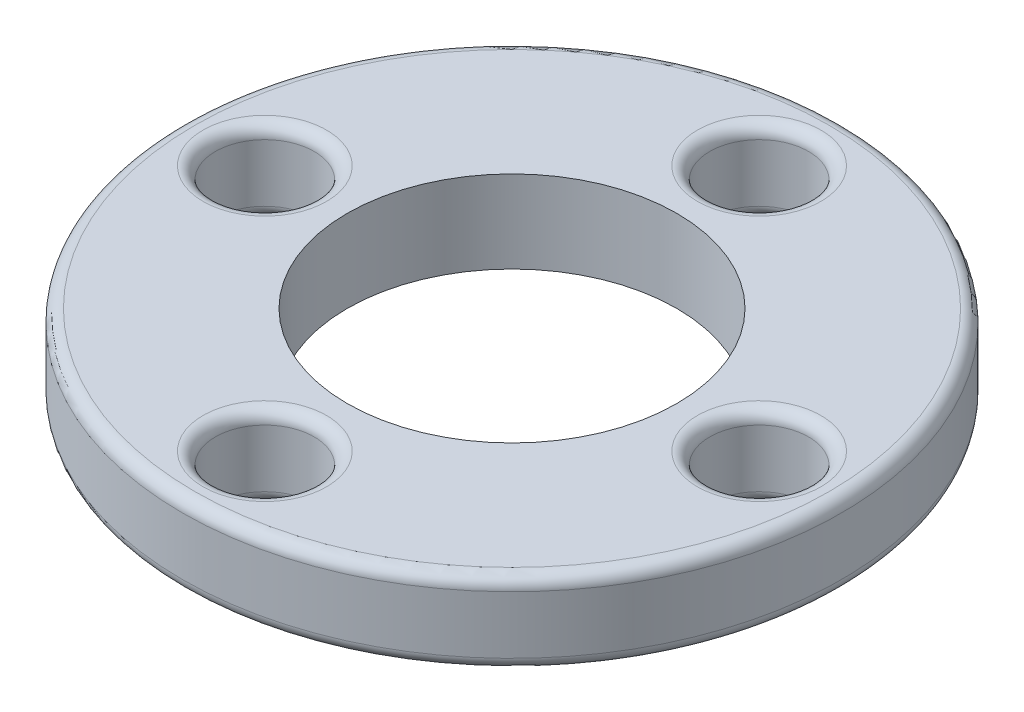
ISO-10303-21;
HEADER;
FILE_DESCRIPTION(('STEP AP214'),'2;1');
FILE_NAME('part.step','',(''),(''),'','','');
FILE_SCHEMA(('AUTOMOTIVE_DESIGN { 1 0 10303 214 1 1 1 1 }'));
ENDSEC;
DATA;
#1=APPLICATION_CONTEXT('core data for automotive mechanical design processes');
#2=APPLICATION_PROTOCOL_DEFINITION('international standard','automotive_design',2000,#1);
#3=PRODUCT_CONTEXT('',#1,'mechanical');
#4=PRODUCT('Part','Part','',(#3));
#5=PRODUCT_RELATED_PRODUCT_CATEGORY('part','',(#4));
#6=PRODUCT_DEFINITION_FORMATION('','',#4);
#7=PRODUCT_DEFINITION_CONTEXT('part definition',#1,'design');
#8=PRODUCT_DEFINITION('design','',#6,#7);
#9=PRODUCT_DEFINITION_SHAPE('','',#8);
#10=(LENGTH_UNIT() NAMED_UNIT(*) SI_UNIT(.MILLI.,.METRE.));
#11=(NAMED_UNIT(*) PLANE_ANGLE_UNIT() SI_UNIT($,.RADIAN.));
#12=(NAMED_UNIT(*) SI_UNIT($,.STERADIAN.) SOLID_ANGLE_UNIT());
#13=UNCERTAINTY_MEASURE_WITH_UNIT(LENGTH_MEASURE(1.E-05),#10,'distance_accuracy_value','');
#14=(GEOMETRIC_REPRESENTATION_CONTEXT(3) GLOBAL_UNCERTAINTY_ASSIGNED_CONTEXT((#13)) GLOBAL_UNIT_ASSIGNED_CONTEXT((#10,
#11,#12)) REPRESENTATION_CONTEXT('',''));
#15=CARTESIAN_POINT('',(0.,0.,0.));
#16=DIRECTION('',(0.,0.,1.));
#17=DIRECTION('',(1.,0.,0.));
#18=AXIS2_PLACEMENT_3D('',#15,#16,#17);
#19=CARTESIAN_POINT('',(0.,2.,0.));
#20=DIRECTION('',(0.,1.,0.));
#21=DIRECTION('',(0.,0.,1.));
#22=AXIS2_PLACEMENT_3D('',#19,#20,#21);
#23=PLANE('',#22);
#24=CARTESIAN_POINT('',(0.,2.,0.));
#25=DIRECTION('',(0.,1.,0.));
#26=DIRECTION('',(0.,0.,1.));
#27=AXIS2_PLACEMENT_3D('',#24,#25,#26);
#28=CIRCLE('',#27,7.7);
#29=CARTESIAN_POINT('',(0.,2.,7.7));
#30=VERTEX_POINT('',#29);
#31=EDGE_CURVE('E10',#30,#30,#28,.T.);
#32=ORIENTED_EDGE('',*,*,#31,.T.);
#33=EDGE_LOOP('',(#32));
#34=FACE_BOUND('',#33,.T.);
#35=CARTESIAN_POINT('',(0.,2.,6.));
#36=DIRECTION('',(0.,1.,0.));
#37=DIRECTION('',(0.,0.,1.));
#38=AXIS2_PLACEMENT_3D('',#35,#36,#37);
#39=CIRCLE('',#38,1.5);
#40=CARTESIAN_POINT('',(0.,2.,7.5));
#41=VERTEX_POINT('',#40);
#42=EDGE_CURVE('E77',#41,#41,#39,.F.);
#43=ORIENTED_EDGE('',*,*,#42,.T.);
#44=EDGE_LOOP('',(#43));
#45=FACE_BOUND('',#44,.T.);
#46=CARTESIAN_POINT('',(6.,2.,0.));
#47=DIRECTION('',(0.,1.,0.));
#48=DIRECTION('',(0.,0.,1.));
#49=AXIS2_PLACEMENT_3D('',#46,#47,#48);
#50=CIRCLE('',#49,1.5);
#51=CARTESIAN_POINT('',(6.,2.,1.50000000000002));
#52=VERTEX_POINT('',#51);
#53=EDGE_CURVE('E80',#52,#52,#50,.F.);
#54=ORIENTED_EDGE('',*,*,#53,.T.);
#55=EDGE_LOOP('',(#54));
#56=FACE_BOUND('',#55,.T.);
#57=CARTESIAN_POINT('',(0.,2.,-6.));
#58=DIRECTION('',(0.,1.,0.));
#59=DIRECTION('',(0.,0.,1.));
#60=AXIS2_PLACEMENT_3D('',#57,#58,#59);
#61=CIRCLE('',#60,1.5);
#62=CARTESIAN_POINT('',(0.,2.,-4.5));
#63=VERTEX_POINT('',#62);
#64=EDGE_CURVE('E83',#63,#63,#61,.F.);
#65=ORIENTED_EDGE('',*,*,#64,.T.);
#66=EDGE_LOOP('',(#65));
#67=FACE_BOUND('',#66,.T.);
#68=CARTESIAN_POINT('',(-6.,2.,0.));
#69=DIRECTION('',(0.,1.,0.));
#70=DIRECTION('',(0.,0.,1.));
#71=AXIS2_PLACEMENT_3D('',#68,#69,#70);
#72=CIRCLE('',#71,1.5);
#73=CARTESIAN_POINT('',(-6.,2.,1.49999999999994));
#74=VERTEX_POINT('',#73);
#75=EDGE_CURVE('E86',#74,#74,#72,.F.);
#76=ORIENTED_EDGE('',*,*,#75,.T.);
#77=EDGE_LOOP('',(#76));
#78=FACE_BOUND('',#77,.T.);
#79=CARTESIAN_POINT('',(0.,2.,0.));
#80=DIRECTION('',(0.,1.,0.));
#81=DIRECTION('',(0.,0.,1.));
#82=AXIS2_PLACEMENT_3D('',#79,#80,#81);
#83=CIRCLE('',#82,4.);
#84=CARTESIAN_POINT('',(0.,2.,4.));
#85=VERTEX_POINT('',#84);
#86=EDGE_CURVE('E107',#85,#85,#83,.T.);
#87=ORIENTED_EDGE('',*,*,#86,.F.);
#88=EDGE_LOOP('',(#87));
#89=FACE_BOUND('',#88,.T.);
#90=ADVANCED_FACE('F39',(#34,#45,#56,#67,#78,#89),#23,.T.);
#91=CARTESIAN_POINT('',(0.,0.,0.));
#92=DIRECTION('',(0.,1.,0.));
#93=DIRECTION('',(0.,0.,1.));
#94=AXIS2_PLACEMENT_3D('',#91,#92,#93);
#95=PLANE('',#94);
#96=CARTESIAN_POINT('',(0.,0.,0.));
#97=DIRECTION('',(0.,1.,0.));
#98=DIRECTION('',(0.,0.,1.));
#99=AXIS2_PLACEMENT_3D('',#96,#97,#98);
#100=CIRCLE('',#99,7.7);
#101=CARTESIAN_POINT('',(0.,0.,7.7));
#102=VERTEX_POINT('',#101);
#103=EDGE_CURVE('E46',#102,#102,#100,.F.);
#104=ORIENTED_EDGE('',*,*,#103,.T.);
#105=EDGE_LOOP('',(#104));
#106=FACE_BOUND('',#105,.T.);
#107=CARTESIAN_POINT('',(0.,0.,6.));
#108=DIRECTION('',(0.,1.,0.));
#109=DIRECTION('',(0.,0.,1.));
#110=AXIS2_PLACEMENT_3D('',#107,#108,#109);
#111=CIRCLE('',#110,1.5);
#112=CARTESIAN_POINT('',(0.,0.,7.5));
#113=VERTEX_POINT('',#112);
#114=EDGE_CURVE('E95',#113,#113,#111,.T.);
#115=ORIENTED_EDGE('',*,*,#114,.T.);
#116=EDGE_LOOP('',(#115));
#117=FACE_BOUND('',#116,.T.);
#118=CARTESIAN_POINT('',(6.,0.,0.));
#119=DIRECTION('',(0.,1.,0.));
#120=DIRECTION('',(0.,0.,1.));
#121=AXIS2_PLACEMENT_3D('',#118,#119,#120);
#122=CIRCLE('',#121,1.5);
#123=CARTESIAN_POINT('',(6.,0.,1.50000000000002));
#124=VERTEX_POINT('',#123);
#125=EDGE_CURVE('E98',#124,#124,#122,.T.);
#126=ORIENTED_EDGE('',*,*,#125,.T.);
#127=EDGE_LOOP('',(#126));
#128=FACE_BOUND('',#127,.T.);
#129=CARTESIAN_POINT('',(0.,0.,-6.));
#130=DIRECTION('',(0.,1.,0.));
#131=DIRECTION('',(0.,0.,1.));
#132=AXIS2_PLACEMENT_3D('',#129,#130,#131);
#133=CIRCLE('',#132,1.5);
#134=CARTESIAN_POINT('',(0.,0.,-4.5));
#135=VERTEX_POINT('',#134);
#136=EDGE_CURVE('E101',#135,#135,#133,.T.);
#137=ORIENTED_EDGE('',*,*,#136,.T.);
#138=EDGE_LOOP('',(#137));
#139=FACE_BOUND('',#138,.T.);
#140=CARTESIAN_POINT('',(-6.,0.,0.));
#141=DIRECTION('',(0.,1.,0.));
#142=DIRECTION('',(0.,0.,1.));
#143=AXIS2_PLACEMENT_3D('',#140,#141,#142);
#144=CIRCLE('',#143,1.5);
#145=CARTESIAN_POINT('',(-6.,0.,1.49999999999994));
#146=VERTEX_POINT('',#145);
#147=EDGE_CURVE('E104',#146,#146,#144,.T.);
#148=ORIENTED_EDGE('',*,*,#147,.T.);
#149=EDGE_LOOP('',(#148));
#150=FACE_BOUND('',#149,.T.);
#151=CARTESIAN_POINT('',(0.,0.,0.));
#152=DIRECTION('',(0.,1.,0.));
#153=DIRECTION('',(0.,0.,1.));
#154=AXIS2_PLACEMENT_3D('',#151,#152,#153);
#155=CIRCLE('',#154,4.);
#156=CARTESIAN_POINT('',(0.,0.,4.));
#157=VERTEX_POINT('',#156);
#158=EDGE_CURVE('E108',#157,#157,#155,.T.);
#159=ORIENTED_EDGE('',*,*,#158,.T.);
#160=EDGE_LOOP('',(#159));
#161=FACE_BOUND('',#160,.T.);
#162=ADVANCED_FACE('F118',(#106,#117,#128,#139,#150,#161),#95,.F.);
#163=CARTESIAN_POINT('',(0.,2.,0.));
#164=DIRECTION('',(0.,-1.,0.));
#165=DIRECTION('',(0.,0.,-1.));
#166=AXIS2_PLACEMENT_3D('',#163,#164,#165);
#167=CYLINDRICAL_SURFACE('',#166,8.);
#168=CARTESIAN_POINT('',(0.,0.3,0.));
#169=DIRECTION('',(0.,1.,0.));
#170=DIRECTION('',(0.,0.,1.));
#171=AXIS2_PLACEMENT_3D('',#168,#169,#170);
#172=CIRCLE('',#171,8.);
#173=CARTESIAN_POINT('',(0.,0.3,8.));
#174=VERTEX_POINT('',#173);
#175=EDGE_CURVE('E50',#174,#174,#172,.T.);
#176=ORIENTED_EDGE('',*,*,#175,.T.);
#177=EDGE_LOOP('',(#176));
#178=FACE_BOUND('',#177,.T.);
#179=CARTESIAN_POINT('',(0.,1.7,0.));
#180=DIRECTION('',(0.,1.,0.));
#181=DIRECTION('',(0.,0.,1.));
#182=AXIS2_PLACEMENT_3D('',#179,#180,#181);
#183=CIRCLE('',#182,8.);
#184=CARTESIAN_POINT('',(0.,1.7,8.));
#185=VERTEX_POINT('',#184);
#186=EDGE_CURVE('E54',#185,#185,#183,.F.);
#187=ORIENTED_EDGE('',*,*,#186,.T.);
#188=EDGE_LOOP('',(#187));
#189=FACE_BOUND('',#188,.T.);
#190=ADVANCED_FACE('F124',(#178,#189),#167,.T.);
#191=CARTESIAN_POINT('',(0.,2.,-6.));
#192=DIRECTION('',(0.,-1.,0.));
#193=DIRECTION('',(0.,0.,-1.));
#194=AXIS2_PLACEMENT_3D('',#191,#192,#193);
#195=CYLINDRICAL_SURFACE('',#194,1.2);
#196=CARTESIAN_POINT('',(0.,0.3,-6.));
#197=DIRECTION('',(0.,1.,0.));
#198=DIRECTION('',(0.,0.,1.));
#199=AXIS2_PLACEMENT_3D('',#196,#197,#198);
#200=CIRCLE('',#199,1.2);
#201=CARTESIAN_POINT('',(0.,0.3,-4.8));
#202=VERTEX_POINT('',#201);
#203=EDGE_CURVE('E65',#202,#202,#200,.F.);
#204=ORIENTED_EDGE('',*,*,#203,.T.);
#205=EDGE_LOOP('',(#204));
#206=FACE_BOUND('',#205,.T.);
#207=CARTESIAN_POINT('',(0.,1.7,-6.));
#208=DIRECTION('',(0.,1.,0.));
#209=DIRECTION('',(0.,0.,1.));
#210=AXIS2_PLACEMENT_3D('',#207,#208,#209);
#211=CIRCLE('',#210,1.2);
#212=CARTESIAN_POINT('',(0.,1.7,-4.8));
#213=VERTEX_POINT('',#212);
#214=EDGE_CURVE('E68',#213,#213,#211,.T.);
#215=ORIENTED_EDGE('',*,*,#214,.T.);
#216=EDGE_LOOP('',(#215));
#217=FACE_BOUND('',#216,.T.);
#218=ADVANCED_FACE('F128',(#206,#217),#195,.F.);
#219=CARTESIAN_POINT('',(0.,2.,0.));
#220=DIRECTION('',(0.,-1.,0.));
#221=DIRECTION('',(0.,0.,-1.));
#222=AXIS2_PLACEMENT_3D('',#219,#220,#221);
#223=CYLINDRICAL_SURFACE('',#222,4.);
#224=ORIENTED_EDGE('',*,*,#86,.T.);
#225=EDGE_LOOP('',(#224));
#226=FACE_BOUND('',#225,.T.);
#227=ORIENTED_EDGE('',*,*,#158,.F.);
#228=EDGE_LOOP('',(#227));
#229=FACE_BOUND('',#228,.T.);
#230=ADVANCED_FACE('F114',(#226,#229),#223,.F.);
#231=CARTESIAN_POINT('',(6.,2.,0.));
#232=DIRECTION('',(0.,-1.,0.));
#233=DIRECTION('',(0.,0.,-1.));
#234=AXIS2_PLACEMENT_3D('',#231,#232,#233);
#235=CYLINDRICAL_SURFACE('',#234,1.2);
#236=CARTESIAN_POINT('',(6.,0.3,0.));
#237=DIRECTION('',(0.,1.,0.));
#238=DIRECTION('',(0.,0.,1.));
#239=AXIS2_PLACEMENT_3D('',#236,#237,#238);
#240=CIRCLE('',#239,1.2);
#241=CARTESIAN_POINT('',(6.,0.3,1.20000000000002));
#242=VERTEX_POINT('',#241);
#243=EDGE_CURVE('E71',#242,#242,#240,.F.);
#244=ORIENTED_EDGE('',*,*,#243,.T.);
#245=EDGE_LOOP('',(#244));
#246=FACE_BOUND('',#245,.T.);
#247=CARTESIAN_POINT('',(6.,1.7,0.));
#248=DIRECTION('',(0.,1.,0.));
#249=DIRECTION('',(0.,0.,1.));
#250=AXIS2_PLACEMENT_3D('',#247,#248,#249);
#251=CIRCLE('',#250,1.2);
#252=CARTESIAN_POINT('',(6.,1.7,1.20000000000002));
#253=VERTEX_POINT('',#252);
#254=EDGE_CURVE('E74',#253,#253,#251,.T.);
#255=ORIENTED_EDGE('',*,*,#254,.T.);
#256=EDGE_LOOP('',(#255));
#257=FACE_BOUND('',#256,.T.);
#258=ADVANCED_FACE('F251',(#246,#257),#235,.F.);
#259=CARTESIAN_POINT('',(0.,2.,6.));
#260=DIRECTION('',(0.,-1.,0.));
#261=DIRECTION('',(0.,0.,-1.));
#262=AXIS2_PLACEMENT_3D('',#259,#260,#261);
#263=CYLINDRICAL_SURFACE('',#262,1.2);
#264=CARTESIAN_POINT('',(0.,0.3,6.));
#265=DIRECTION('',(0.,1.,0.));
#266=DIRECTION('',(0.,0.,1.));
#267=AXIS2_PLACEMENT_3D('',#264,#265,#266);
#268=CIRCLE('',#267,1.2);
#269=CARTESIAN_POINT('',(0.,0.3,7.2));
#270=VERTEX_POINT('',#269);
#271=EDGE_CURVE('E89',#270,#270,#268,.F.);
#272=ORIENTED_EDGE('',*,*,#271,.T.);
#273=EDGE_LOOP('',(#272));
#274=FACE_BOUND('',#273,.T.);
#275=CARTESIAN_POINT('',(0.,1.7,6.));
#276=DIRECTION('',(0.,1.,0.));
#277=DIRECTION('',(0.,0.,1.));
#278=AXIS2_PLACEMENT_3D('',#275,#276,#277);
#279=CIRCLE('',#278,1.2);
#280=CARTESIAN_POINT('',(0.,1.7,7.2));
#281=VERTEX_POINT('',#280);
#282=EDGE_CURVE('E92',#281,#281,#279,.T.);
#283=ORIENTED_EDGE('',*,*,#282,.T.);
#284=EDGE_LOOP('',(#283));
#285=FACE_BOUND('',#284,.T.);
#286=ADVANCED_FACE('F241',(#274,#285),#263,.F.);
#287=CARTESIAN_POINT('',(-6.,2.,0.));
#288=DIRECTION('',(0.,-1.,0.));
#289=DIRECTION('',(0.,0.,-1.));
#290=AXIS2_PLACEMENT_3D('',#287,#288,#289);
#291=CYLINDRICAL_SURFACE('',#290,1.2);
#292=CARTESIAN_POINT('',(-6.,0.3,0.));
#293=DIRECTION('',(0.,1.,0.));
#294=DIRECTION('',(0.,0.,1.));
#295=AXIS2_PLACEMENT_3D('',#292,#293,#294);
#296=CIRCLE('',#295,1.2);
#297=CARTESIAN_POINT('',(-6.,0.3,1.19999999999994));
#298=VERTEX_POINT('',#297);
#299=EDGE_CURVE('E59',#298,#298,#296,.F.);
#300=ORIENTED_EDGE('',*,*,#299,.T.);
#301=EDGE_LOOP('',(#300));
#302=FACE_BOUND('',#301,.T.);
#303=CARTESIAN_POINT('',(-6.,1.7,0.));
#304=DIRECTION('',(0.,1.,0.));
#305=DIRECTION('',(0.,0.,1.));
#306=AXIS2_PLACEMENT_3D('',#303,#304,#305);
#307=CIRCLE('',#306,1.2);
#308=CARTESIAN_POINT('',(-6.,1.7,1.19999999999994));
#309=VERTEX_POINT('',#308);
#310=EDGE_CURVE('E62',#309,#309,#307,.T.);
#311=ORIENTED_EDGE('',*,*,#310,.T.);
#312=EDGE_LOOP('',(#311));
#313=FACE_BOUND('',#312,.T.);
#314=ADVANCED_FACE('F138',(#302,#313),#291,.F.);
#315=CARTESIAN_POINT('',(0.,0.3,6.));
#316=DIRECTION('',(0.,1.,0.));
#317=DIRECTION('',(0.,0.,1.));
#318=AXIS2_PLACEMENT_3D('',#315,#316,#317);
#319=TOROIDAL_SURFACE('',#318,1.5,0.3);
#320=ORIENTED_EDGE('',*,*,#271,.F.);
#321=EDGE_LOOP('',(#320));
#322=FACE_BOUND('',#321,.T.);
#323=ORIENTED_EDGE('',*,*,#114,.F.);
#324=EDGE_LOOP('',(#323));
#325=FACE_BOUND('',#324,.T.);
#326=ADVANCED_FACE('F134',(#322,#325),#319,.T.);
#327=CARTESIAN_POINT('',(0.,1.7,6.));
#328=DIRECTION('',(0.,1.,0.));
#329=DIRECTION('',(0.,0.,1.));
#330=AXIS2_PLACEMENT_3D('',#327,#328,#329);
#331=TOROIDAL_SURFACE('',#330,1.5,0.3);
#332=ORIENTED_EDGE('',*,*,#42,.F.);
#333=EDGE_LOOP('',(#332));
#334=FACE_BOUND('',#333,.T.);
#335=ORIENTED_EDGE('',*,*,#282,.F.);
#336=EDGE_LOOP('',(#335));
#337=FACE_BOUND('',#336,.T.);
#338=ADVANCED_FACE('F137',(#334,#337),#331,.T.);
#339=CARTESIAN_POINT('',(6.,0.3,0.));
#340=DIRECTION('',(0.,1.,0.));
#341=DIRECTION('',(0.,0.,1.));
#342=AXIS2_PLACEMENT_3D('',#339,#340,#341);
#343=TOROIDAL_SURFACE('',#342,1.5,0.3);
#344=ORIENTED_EDGE('',*,*,#243,.F.);
#345=EDGE_LOOP('',(#344));
#346=FACE_BOUND('',#345,.T.);
#347=ORIENTED_EDGE('',*,*,#125,.F.);
#348=EDGE_LOOP('',(#347));
#349=FACE_BOUND('',#348,.T.);
#350=ADVANCED_FACE('F142',(#346,#349),#343,.T.);
#351=CARTESIAN_POINT('',(6.,1.7,0.));
#352=DIRECTION('',(0.,1.,0.));
#353=DIRECTION('',(0.,0.,1.));
#354=AXIS2_PLACEMENT_3D('',#351,#352,#353);
#355=TOROIDAL_SURFACE('',#354,1.5,0.3);
#356=ORIENTED_EDGE('',*,*,#53,.F.);
#357=EDGE_LOOP('',(#356));
#358=FACE_BOUND('',#357,.T.);
#359=ORIENTED_EDGE('',*,*,#254,.F.);
#360=EDGE_LOOP('',(#359));
#361=FACE_BOUND('',#360,.T.);
#362=ADVANCED_FACE('F146',(#358,#361),#355,.T.);
#363=CARTESIAN_POINT('',(0.,0.3,-6.));
#364=DIRECTION('',(0.,1.,0.));
#365=DIRECTION('',(0.,0.,1.));
#366=AXIS2_PLACEMENT_3D('',#363,#364,#365);
#367=TOROIDAL_SURFACE('',#366,1.5,0.3);
#368=ORIENTED_EDGE('',*,*,#203,.F.);
#369=EDGE_LOOP('',(#368));
#370=FACE_BOUND('',#369,.T.);
#371=ORIENTED_EDGE('',*,*,#136,.F.);
#372=EDGE_LOOP('',(#371));
#373=FACE_BOUND('',#372,.T.);
#374=ADVANCED_FACE('F150',(#370,#373),#367,.T.);
#375=CARTESIAN_POINT('',(0.,1.7,-6.));
#376=DIRECTION('',(0.,1.,0.));
#377=DIRECTION('',(0.,0.,1.));
#378=AXIS2_PLACEMENT_3D('',#375,#376,#377);
#379=TOROIDAL_SURFACE('',#378,1.5,0.3);
#380=ORIENTED_EDGE('',*,*,#64,.F.);
#381=EDGE_LOOP('',(#380));
#382=FACE_BOUND('',#381,.T.);
#383=ORIENTED_EDGE('',*,*,#214,.F.);
#384=EDGE_LOOP('',(#383));
#385=FACE_BOUND('',#384,.T.);
#386=ADVANCED_FACE('F154',(#382,#385),#379,.T.);
#387=CARTESIAN_POINT('',(-6.,0.3,0.));
#388=DIRECTION('',(0.,1.,0.));
#389=DIRECTION('',(0.,0.,1.));
#390=AXIS2_PLACEMENT_3D('',#387,#388,#389);
#391=TOROIDAL_SURFACE('',#390,1.5,0.3);
#392=ORIENTED_EDGE('',*,*,#299,.F.);
#393=EDGE_LOOP('',(#392));
#394=FACE_BOUND('',#393,.T.);
#395=ORIENTED_EDGE('',*,*,#147,.F.);
#396=EDGE_LOOP('',(#395));
#397=FACE_BOUND('',#396,.T.);
#398=ADVANCED_FACE('F158',(#394,#397),#391,.T.);
#399=CARTESIAN_POINT('',(-6.,1.7,0.));
#400=DIRECTION('',(0.,1.,0.));
#401=DIRECTION('',(0.,0.,1.));
#402=AXIS2_PLACEMENT_3D('',#399,#400,#401);
#403=TOROIDAL_SURFACE('',#402,1.5,0.3);
#404=ORIENTED_EDGE('',*,*,#75,.F.);
#405=EDGE_LOOP('',(#404));
#406=FACE_BOUND('',#405,.T.);
#407=ORIENTED_EDGE('',*,*,#310,.F.);
#408=EDGE_LOOP('',(#407));
#409=FACE_BOUND('',#408,.T.);
#410=ADVANCED_FACE('F162',(#406,#409),#403,.T.);
#411=CARTESIAN_POINT('',(0.,0.3,0.));
#412=DIRECTION('',(0.,1.,0.));
#413=DIRECTION('',(0.,0.,1.));
#414=AXIS2_PLACEMENT_3D('',#411,#412,#413);
#415=TOROIDAL_SURFACE('',#414,7.7,0.3);
#416=ORIENTED_EDGE('',*,*,#103,.F.);
#417=EDGE_LOOP('',(#416));
#418=FACE_BOUND('',#417,.T.);
#419=ORIENTED_EDGE('',*,*,#175,.F.);
#420=EDGE_LOOP('',(#419));
#421=FACE_BOUND('',#420,.T.);
#422=ADVANCED_FACE('F164',(#418,#421),#415,.T.);
#423=CARTESIAN_POINT('',(0.,1.7,0.));
#424=DIRECTION('',(0.,1.,0.));
#425=DIRECTION('',(0.,0.,1.));
#426=AXIS2_PLACEMENT_3D('',#423,#424,#425);
#427=TOROIDAL_SURFACE('',#426,7.7,0.3);
#428=ORIENTED_EDGE('',*,*,#186,.F.);
#429=EDGE_LOOP('',(#428));
#430=FACE_BOUND('',#429,.T.);
#431=ORIENTED_EDGE('',*,*,#31,.F.);
#432=EDGE_LOOP('',(#431));
#433=FACE_BOUND('',#432,.T.);
#434=ADVANCED_FACE('F41',(#430,#433),#427,.T.);
#435=CLOSED_SHELL('',(#90,#162,#190,#218,#230,#258,#286,#314,#326,#338,#350,#362,#374,#386,#398,
#410,#422,#434));
#436=MANIFOLD_SOLID_BREP('B2',#435);
#437=ADVANCED_BREP_SHAPE_REPRESENTATION('',(#18,#436),#14);
#438=SHAPE_DEFINITION_REPRESENTATION(#9,#437);
ENDSEC;
END-ISO-10303-21;
